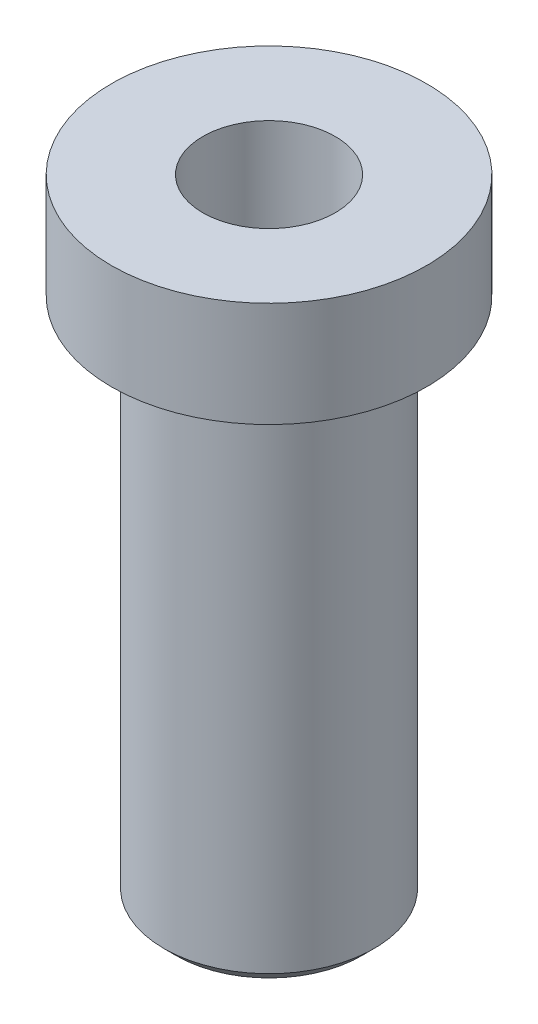
ISO-10303-21;
HEADER;
FILE_DESCRIPTION(('STEP AP214'),'2;1');
FILE_NAME('part.step','',(''),(''),'','','');
FILE_SCHEMA(('AUTOMOTIVE_DESIGN { 1 0 10303 214 1 1 1 1 }'));
ENDSEC;
DATA;
#1=APPLICATION_CONTEXT('core data for automotive mechanical design processes');
#2=APPLICATION_PROTOCOL_DEFINITION('international standard','automotive_design',2000,#1);
#3=PRODUCT_CONTEXT('',#1,'mechanical');
#4=PRODUCT('Part','Part','',(#3));
#5=PRODUCT_RELATED_PRODUCT_CATEGORY('part','',(#4));
#6=PRODUCT_DEFINITION_FORMATION('','',#4);
#7=PRODUCT_DEFINITION_CONTEXT('part definition',#1,'design');
#8=PRODUCT_DEFINITION('design','',#6,#7);
#9=PRODUCT_DEFINITION_SHAPE('','',#8);
#10=(LENGTH_UNIT() NAMED_UNIT(*) SI_UNIT(.MILLI.,.METRE.));
#11=(NAMED_UNIT(*) PLANE_ANGLE_UNIT() SI_UNIT($,.RADIAN.));
#12=(NAMED_UNIT(*) SI_UNIT($,.STERADIAN.) SOLID_ANGLE_UNIT());
#13=UNCERTAINTY_MEASURE_WITH_UNIT(LENGTH_MEASURE(1.E-05),#10,'distance_accuracy_value','');
#14=(GEOMETRIC_REPRESENTATION_CONTEXT(3) GLOBAL_UNCERTAINTY_ASSIGNED_CONTEXT((#13)) GLOBAL_UNIT_ASSIGNED_CONTEXT((#10,
#11,#12)) REPRESENTATION_CONTEXT('',''));
#15=CARTESIAN_POINT('',(0.,0.,0.));
#16=DIRECTION('',(0.,0.,1.));
#17=DIRECTION('',(1.,0.,0.));
#18=AXIS2_PLACEMENT_3D('',#15,#16,#17);
#19=CARTESIAN_POINT('',(0.,38.1,0.));
#20=DIRECTION('',(0.,-1.,0.));
#21=DIRECTION('',(0.,0.,-1.));
#22=AXIS2_PLACEMENT_3D('',#19,#20,#21);
#23=CYLINDRICAL_SURFACE('',#22,12.7);
#24=CARTESIAN_POINT('',(0.,-36.576,0.));
#25=DIRECTION('',(0.,1.,0.));
#26=DIRECTION('',(0.,0.,1.));
#27=AXIS2_PLACEMENT_3D('',#24,#25,#26);
#28=CIRCLE('',#27,12.7);
#29=CARTESIAN_POINT('',(0.,-36.576,-12.7));
#30=VERTEX_POINT('',#29);
#31=EDGE_CURVE('E47',#30,#30,#28,.T.);
#32=CARTESIAN_POINT('',(0.,25.4,0.));
#33=DIRECTION('',(0.,1.,0.));
#34=DIRECTION('',(0.,0.,1.));
#35=AXIS2_PLACEMENT_3D('',#32,#33,#34);
#36=CIRCLE('',#35,12.7);
#37=CARTESIAN_POINT('',(0.,25.4,-12.7));
#38=VERTEX_POINT('',#37);
#39=EDGE_CURVE('E51',#38,#38,#36,.T.);
#40=CARTESIAN_POINT('',(0.,-36.576,-12.7));
#41=CARTESIAN_POINT('',(0.,-35.9304166666667,-12.7));
#42=CARTESIAN_POINT('',(0.,-35.2848333333333,-12.7));
#43=CARTESIAN_POINT('',(0.,-33.9936666666667,-12.7));
#44=CARTESIAN_POINT('',(0.,-33.3480833333333,-12.7));
#45=CARTESIAN_POINT('',(0.,-32.0569166666667,-12.7));
#46=CARTESIAN_POINT('',(0.,-31.4113333333333,-12.7));
#47=CARTESIAN_POINT('',(0.,-30.1201666666667,-12.7));
#48=CARTESIAN_POINT('',(0.,-29.4745833333333,-12.7));
#49=CARTESIAN_POINT('',(0.,-28.1834166666667,-12.7));
#50=CARTESIAN_POINT('',(0.,-27.5378333333333,-12.7));
#51=CARTESIAN_POINT('',(0.,-26.2466666666667,-12.7));
#52=CARTESIAN_POINT('',(0.,-25.6010833333333,-12.7));
#53=CARTESIAN_POINT('',(0.,-24.3099166666667,-12.7));
#54=CARTESIAN_POINT('',(0.,-23.6643333333333,-12.7));
#55=CARTESIAN_POINT('',(0.,-22.3731666666667,-12.7));
#56=CARTESIAN_POINT('',(0.,-21.7275833333333,-12.7));
#57=CARTESIAN_POINT('',(0.,-20.4364166666667,-12.7));
#58=CARTESIAN_POINT('',(0.,-19.7908333333333,-12.7));
#59=CARTESIAN_POINT('',(0.,-18.4996666666667,-12.7));
#60=CARTESIAN_POINT('',(0.,-17.8540833333333,-12.7));
#61=CARTESIAN_POINT('',(0.,-16.5629166666667,-12.7));
#62=CARTESIAN_POINT('',(0.,-15.9173333333333,-12.7));
#63=CARTESIAN_POINT('',(0.,-14.6261666666667,-12.7));
#64=CARTESIAN_POINT('',(0.,-13.9805833333333,-12.7));
#65=CARTESIAN_POINT('',(0.,-12.6894166666667,-12.7));
#66=CARTESIAN_POINT('',(0.,-12.0438333333333,-12.7));
#67=CARTESIAN_POINT('',(0.,-10.7526666666667,-12.7));
#68=CARTESIAN_POINT('',(0.,-10.1070833333333,-12.7));
#69=CARTESIAN_POINT('',(0.,-8.81591666666667,-12.7));
#70=CARTESIAN_POINT('',(0.,-8.17033333333334,-12.7));
#71=CARTESIAN_POINT('',(0.,-6.87916666666667,-12.7));
#72=CARTESIAN_POINT('',(0.,-6.23358333333334,-12.7));
#73=CARTESIAN_POINT('',(0.,-4.94241666666667,-12.7));
#74=CARTESIAN_POINT('',(0.,-4.29683333333334,-12.7));
#75=CARTESIAN_POINT('',(0.,-3.00566666666667,-12.7));
#76=CARTESIAN_POINT('',(0.,-2.36008333333333,-12.7));
#77=CARTESIAN_POINT('',(0.,-1.06891666666667,-12.7));
#78=CARTESIAN_POINT('',(0.,-0.423333333333333,-12.7));
#79=CARTESIAN_POINT('',(0.,0.867833333333334,-12.7));
#80=CARTESIAN_POINT('',(0.,1.51341666666667,-12.7));
#81=CARTESIAN_POINT('',(0.,2.80458333333333,-12.7));
#82=CARTESIAN_POINT('',(0.,3.45016666666667,-12.7));
#83=CARTESIAN_POINT('',(0.,4.74133333333334,-12.7));
#84=CARTESIAN_POINT('',(0.,5.38691666666667,-12.7));
#85=CARTESIAN_POINT('',(0.,6.67808333333334,-12.7));
#86=CARTESIAN_POINT('',(0.,7.32366666666667,-12.7));
#87=CARTESIAN_POINT('',(0.,8.61483333333333,-12.7));
#88=CARTESIAN_POINT('',(0.,9.26041666666666,-12.7));
#89=CARTESIAN_POINT('',(0.,10.5515833333333,-12.7));
#90=CARTESIAN_POINT('',(0.,11.1971666666667,-12.7));
#91=CARTESIAN_POINT('',(0.,12.4883333333333,-12.7));
#92=CARTESIAN_POINT('',(0.,13.1339166666667,-12.7));
#93=CARTESIAN_POINT('',(0.,14.4250833333333,-12.7));
#94=CARTESIAN_POINT('',(0.,15.0706666666667,-12.7));
#95=CARTESIAN_POINT('',(0.,16.3618333333333,-12.7));
#96=CARTESIAN_POINT('',(0.,17.0074166666667,-12.7));
#97=CARTESIAN_POINT('',(0.,18.2985833333333,-12.7));
#98=CARTESIAN_POINT('',(0.,18.9441666666667,-12.7));
#99=CARTESIAN_POINT('',(0.,20.2353333333333,-12.7));
#100=CARTESIAN_POINT('',(0.,20.8809166666667,-12.7));
#101=CARTESIAN_POINT('',(0.,22.1720833333333,-12.7));
#102=CARTESIAN_POINT('',(0.,22.8176666666667,-12.7));
#103=CARTESIAN_POINT('',(0.,24.1088333333333,-12.7));
#104=CARTESIAN_POINT('',(0.,24.7544166666667,-12.7));
#105=CARTESIAN_POINT('',(0.,25.4,-12.7));
#106=B_SPLINE_CURVE_WITH_KNOTS('',3,(#40,#41,#42,#43,#44,#45,#46,#47,#48,#49,#50,#51,#52,#53,
#54,#55,#56,#57,#58,#59,#60,#61,#62,#63,#64,#65,#66,#67,#68,#69,#70,#71,#72,#73,#74,#75,#76,#77,
#78,#79,#80,#81,#82,#83,#84,#85,#86,#87,#88,#89,#90,#91,#92,#93,#94,#95,#96,#97,#98,#99,#100,
#101,#102,#103,#104,#105),.UNSPECIFIED.,.F.,.F.,(4,2,2,2,2,2,2,2,2,2,2,2,2,2,2,2,2,2,2,2,2,2,2,
2,2,2,2,2,2,2,2,2,4),(0.,1.93675,3.8735,5.81025,7.747,9.68375000000001,11.6205,13.55725,15.494,
17.43075,19.3675,21.30425,23.241,25.17775,27.1145,29.05125,30.988,32.92475,34.8615,36.79825,
38.735,40.67175,42.6085,44.54525,46.482,48.41875,50.3555,52.29225,54.229,56.16575,58.1025,
60.03925,61.976),.UNSPECIFIED.);
#107=EDGE_CURVE('BSEAM39',#30,#38,#106,.T.);
#108=ORIENTED_EDGE('',*,*,#31,.T.);
#109=ORIENTED_EDGE('',*,*,#39,.F.);
#110=ORIENTED_EDGE('',*,*,#107,.T.);
#111=ORIENTED_EDGE('',*,*,#107,.F.);
#112=EDGE_LOOP('',(#108,#110,#109,#111));
#113=FACE_BOUND('',#112,.T.);
#114=ADVANCED_FACE('F39',(#113),#23,.T.);
#115=CARTESIAN_POINT('',(0.,-38.1,0.));
#116=DIRECTION('',(0.,1.,0.));
#117=DIRECTION('',(0.,0.,1.));
#118=AXIS2_PLACEMENT_3D('',#115,#116,#117);
#119=PLANE('',#118);
#120=CARTESIAN_POINT('',(0.,-38.1,0.));
#121=DIRECTION('',(0.,1.,0.));
#122=DIRECTION('',(0.,0.,1.));
#123=AXIS2_PLACEMENT_3D('',#120,#121,#122);
#124=CIRCLE('',#123,11.176);
#125=CARTESIAN_POINT('',(0.,-38.1,11.176));
#126=VERTEX_POINT('',#125);
#127=EDGE_CURVE('E10',#126,#126,#124,.F.);
#128=ORIENTED_EDGE('',*,*,#127,.T.);
#129=EDGE_LOOP('',(#128));
#130=FACE_BOUND('',#129,.T.);
#131=CARTESIAN_POINT('',(0.,-38.1,0.));
#132=DIRECTION('',(0.,1.,0.));
#133=DIRECTION('',(0.,0.,1.));
#134=AXIS2_PLACEMENT_3D('',#131,#132,#133);
#135=CIRCLE('',#134,8.001);
#136=CARTESIAN_POINT('',(0.,-38.1,8.001));
#137=VERTEX_POINT('',#136);
#138=EDGE_CURVE('E61',#137,#137,#135,.T.);
#139=ORIENTED_EDGE('',*,*,#138,.T.);
#140=EDGE_LOOP('',(#139));
#141=FACE_BOUND('',#140,.T.);
#142=ADVANCED_FACE('F81',(#130,#141),#119,.F.);
#143=CARTESIAN_POINT('',(0.,25.4,0.));
#144=DIRECTION('',(0.,1.,0.));
#145=DIRECTION('',(0.,0.,1.));
#146=AXIS2_PLACEMENT_3D('',#143,#144,#145);
#147=CYLINDRICAL_SURFACE('',#146,19.05);
#148=CARTESIAN_POINT('',(0.,25.4,0.));
#149=DIRECTION('',(0.,1.,0.));
#150=DIRECTION('',(0.,0.,1.));
#151=AXIS2_PLACEMENT_3D('',#148,#149,#150);
#152=CIRCLE('',#151,19.05);
#153=CARTESIAN_POINT('',(0.,25.4,19.05));
#154=VERTEX_POINT('',#153);
#155=EDGE_CURVE('E55',#154,#154,#152,.T.);
#156=ORIENTED_EDGE('',*,*,#155,.T.);
#157=EDGE_LOOP('',(#156));
#158=FACE_BOUND('',#157,.T.);
#159=CARTESIAN_POINT('',(0.,38.1,0.));
#160=DIRECTION('',(0.,1.,0.));
#161=DIRECTION('',(0.,0.,1.));
#162=AXIS2_PLACEMENT_3D('',#159,#160,#161);
#163=CIRCLE('',#162,19.05);
#164=CARTESIAN_POINT('',(0.,38.1,19.05));
#165=VERTEX_POINT('',#164);
#166=EDGE_CURVE('E58',#165,#165,#163,.T.);
#167=ORIENTED_EDGE('',*,*,#166,.F.);
#168=EDGE_LOOP('',(#167));
#169=FACE_BOUND('',#168,.T.);
#170=ADVANCED_FACE('F79',(#158,#169),#147,.T.);
#171=CARTESIAN_POINT('',(0.,25.4,0.));
#172=DIRECTION('',(0.,1.,0.));
#173=DIRECTION('',(0.,0.,1.));
#174=AXIS2_PLACEMENT_3D('',#171,#172,#173);
#175=PLANE('',#174);
#176=ORIENTED_EDGE('',*,*,#39,.T.);
#177=EDGE_LOOP('',(#176));
#178=FACE_BOUND('',#177,.T.);
#179=ORIENTED_EDGE('',*,*,#155,.F.);
#180=EDGE_LOOP('',(#179));
#181=FACE_BOUND('',#180,.T.);
#182=ADVANCED_FACE('F75',(#178,#181),#175,.F.);
#183=CARTESIAN_POINT('',(0.,38.1,0.));
#184=DIRECTION('',(0.,1.,0.));
#185=DIRECTION('',(0.,0.,1.));
#186=AXIS2_PLACEMENT_3D('',#183,#184,#185);
#187=PLANE('',#186);
#188=CARTESIAN_POINT('',(0.,38.1,0.));
#189=DIRECTION('',(0.,1.,0.));
#190=DIRECTION('',(0.,0.,1.));
#191=AXIS2_PLACEMENT_3D('',#188,#189,#190);
#192=CIRCLE('',#191,8.00100000000002);
#193=CARTESIAN_POINT('',(0.,38.1,8.00100000000002));
#194=VERTEX_POINT('',#193);
#195=EDGE_CURVE('E66',#194,#194,#192,.T.);
#196=ORIENTED_EDGE('',*,*,#195,.F.);
#197=EDGE_LOOP('',(#196));
#198=FACE_BOUND('',#197,.T.);
#199=ORIENTED_EDGE('',*,*,#166,.T.);
#200=EDGE_LOOP('',(#199));
#201=FACE_BOUND('',#200,.T.);
#202=ADVANCED_FACE('F72',(#198,#201),#187,.T.);
#203=CARTESIAN_POINT('',(0.,38.1,0.));
#204=DIRECTION('',(0.,1.,0.));
#205=DIRECTION('',(0.,0.,1.));
#206=AXIS2_PLACEMENT_3D('',#203,#204,#205);
#207=CYLINDRICAL_SURFACE('',#206,8.00100000000001);
#208=ORIENTED_EDGE('',*,*,#138,.F.);
#209=EDGE_LOOP('',(#208));
#210=FACE_BOUND('',#209,.T.);
#211=ORIENTED_EDGE('',*,*,#195,.T.);
#212=EDGE_LOOP('',(#211));
#213=FACE_BOUND('',#212,.T.);
#214=ADVANCED_FACE('F70',(#210,#213),#207,.F.);
#215=CARTESIAN_POINT('',(0.,-36.576,0.));
#216=DIRECTION('',(0.,1.,0.));
#217=DIRECTION('',(0.,0.,1.));
#218=AXIS2_PLACEMENT_3D('',#215,#216,#217);
#219=CONICAL_SURFACE('',#218,12.7,0.785398163397457);
#220=ORIENTED_EDGE('',*,*,#127,.F.);
#221=EDGE_LOOP('',(#220));
#222=FACE_BOUND('',#221,.T.);
#223=ORIENTED_EDGE('',*,*,#31,.F.);
#224=EDGE_LOOP('',(#223));
#225=FACE_BOUND('',#224,.T.);
#226=ADVANCED_FACE('F42',(#222,#225),#219,.T.);
#227=CLOSED_SHELL('',(#114,#142,#170,#182,#202,#214,#226));
#228=MANIFOLD_SOLID_BREP('B2',#227);
#229=ADVANCED_BREP_SHAPE_REPRESENTATION('',(#18,#228),#14);
#230=SHAPE_DEFINITION_REPRESENTATION(#9,#229);
ENDSEC;
END-ISO-10303-21;
